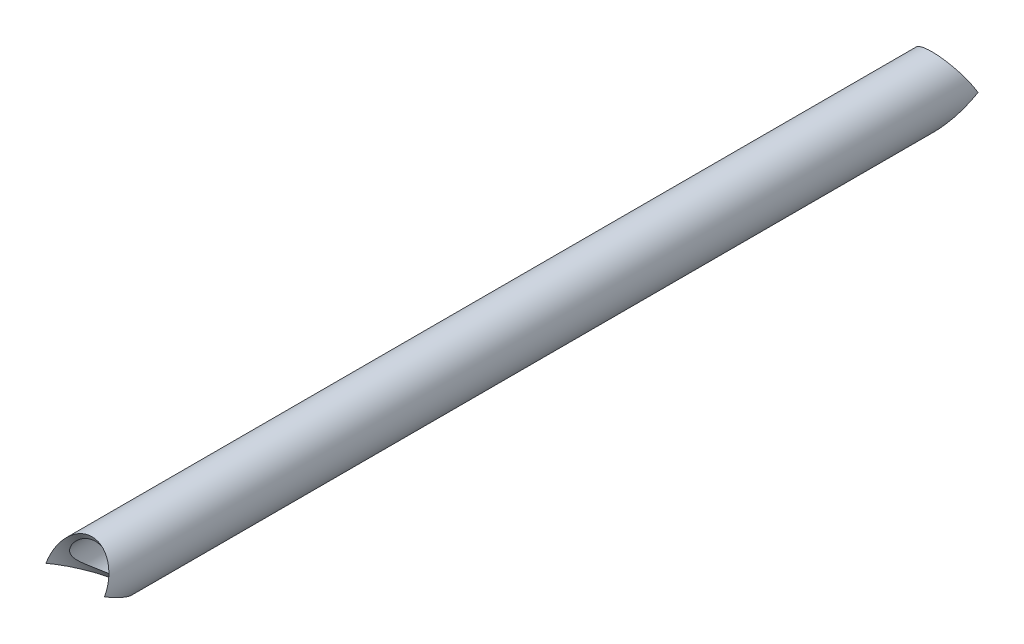
ISO-10303-21;
HEADER;
FILE_DESCRIPTION(('STEP AP214'),'2;1');
FILE_NAME('part.step','',(''),(''),'','','');
FILE_SCHEMA(('AUTOMOTIVE_DESIGN { 1 0 10303 214 1 1 1 1 }'));
ENDSEC;
DATA;
#1=APPLICATION_CONTEXT('core data for automotive mechanical design processes');
#2=APPLICATION_PROTOCOL_DEFINITION('international standard','automotive_design',2000,#1);
#3=PRODUCT_CONTEXT('',#1,'mechanical');
#4=PRODUCT('Part','Part','',(#3));
#5=PRODUCT_RELATED_PRODUCT_CATEGORY('part','',(#4));
#6=PRODUCT_DEFINITION_FORMATION('','',#4);
#7=PRODUCT_DEFINITION_CONTEXT('part definition',#1,'design');
#8=PRODUCT_DEFINITION('design','',#6,#7);
#9=PRODUCT_DEFINITION_SHAPE('','',#8);
#10=(LENGTH_UNIT() NAMED_UNIT(*) SI_UNIT(.MILLI.,.METRE.));
#11=(NAMED_UNIT(*) PLANE_ANGLE_UNIT() SI_UNIT($,.RADIAN.));
#12=(NAMED_UNIT(*) SI_UNIT($,.STERADIAN.) SOLID_ANGLE_UNIT());
#13=UNCERTAINTY_MEASURE_WITH_UNIT(LENGTH_MEASURE(1.E-05),#10,'distance_accuracy_value','');
#14=(GEOMETRIC_REPRESENTATION_CONTEXT(3) GLOBAL_UNCERTAINTY_ASSIGNED_CONTEXT((#13)) GLOBAL_UNIT_ASSIGNED_CONTEXT((#10,
#11,#12)) REPRESENTATION_CONTEXT('',''));
#15=CARTESIAN_POINT('',(0.,0.,0.));
#16=DIRECTION('',(0.,0.,1.));
#17=DIRECTION('',(1.,0.,0.));
#18=AXIS2_PLACEMENT_3D('',#15,#16,#17);
#19=CARTESIAN_POINT('',(8.58078819920598E-13,-5.32500000000106,-171.724170550265));
#20=DIRECTION('',(0.,0.,1.));
#21=DIRECTION('',(1.,0.,0.));
#22=AXIS2_PLACEMENT_3D('',#19,#20,#21);
#23=CYLINDRICAL_SURFACE('',#22,10.65);
#24=CARTESIAN_POINT('',(7.51697976491985E-13,-5.32500000000106,-159.425609816526));
#25=DIRECTION('',(0.,0.866025403784403,0.500000000000062));
#26=DIRECTION('',(0.,-0.500000000000061,0.866025403784403));
#27=AXIS2_PLACEMENT_3D('',#24,#25,#26);
#28=ELLIPSE('',#27,21.2999999999974,10.65);
#29=CARTESIAN_POINT('',(-10.6499999999992,-5.32500000000106,-159.425609816526));
#30=VERTEX_POINT('',#29);
#31=CARTESIAN_POINT('',(10.6500000000008,-5.32500000000106,-159.425609816526));
#32=VERTEX_POINT('',#31);
#33=EDGE_CURVE('E40',#30,#32,#28,.T.);
#34=ORIENTED_EDGE('',*,*,#33,.T.);
#35=CARTESIAN_POINT('',(7.51697976491985E-13,-5.32500000000106,-159.425609816526));
#36=DIRECTION('',(0.,-0.500000000000061,0.866025403784403));
#37=DIRECTION('',(0.,0.866025403784403,0.500000000000062));
#38=AXIS2_PLACEMENT_3D('',#35,#36,#37);
#39=ELLIPSE('',#38,12.2975607337395,10.65);
#40=EDGE_CURVE('E46',#32,#30,#39,.T.);
#41=ORIENTED_EDGE('',*,*,#40,.T.);
#42=EDGE_LOOP('',(#34,#41));
#43=FACE_BOUND('',#42,.T.);
#44=CARTESIAN_POINT('',(7.51697976491985E-13,-5.32500000000106,159.425609816526));
#45=DIRECTION('',(0.,-0.866025403784403,0.500000000000062));
#46=DIRECTION('',(0.,-0.500000000000061,-0.866025403784403));
#47=AXIS2_PLACEMENT_3D('',#44,#45,#46);
#48=ELLIPSE('',#47,21.2999999999974,10.65);
#49=CARTESIAN_POINT('',(-10.6499999999992,-5.32500000000106,159.425609816526));
#50=VERTEX_POINT('',#49);
#51=CARTESIAN_POINT('',(10.6500000000008,-5.32500000000106,159.425609816526));
#52=VERTEX_POINT('',#51);
#53=EDGE_CURVE('E65',#50,#52,#48,.T.);
#54=ORIENTED_EDGE('',*,*,#53,.F.);
#55=CARTESIAN_POINT('',(7.51697976491985E-13,-5.32500000000106,159.425609816526));
#56=DIRECTION('',(0.,0.500000000000061,0.866025403784403));
#57=DIRECTION('',(0.,0.866025403784403,-0.500000000000062));
#58=AXIS2_PLACEMENT_3D('',#55,#56,#57);
#59=ELLIPSE('',#58,12.2975607337395,10.65);
#60=EDGE_CURVE('E61',#52,#50,#59,.T.);
#61=ORIENTED_EDGE('',*,*,#60,.F.);
#62=EDGE_LOOP('',(#54,#61));
#63=FACE_BOUND('',#62,.T.);
#64=ADVANCED_FACE('F35',(#43,#63),#23,.T.);
#65=CARTESIAN_POINT('',(8.58078819920598E-13,-5.32500000000106,-171.724170550265));
#66=DIRECTION('',(0.,0.,1.));
#67=DIRECTION('',(1.,0.,0.));
#68=AXIS2_PLACEMENT_3D('',#65,#66,#67);
#69=CYLINDRICAL_SURFACE('',#68,8.65);
#70=CARTESIAN_POINT('',(8.65000000000086,-5.32500000000106,-152.251582588625));
#71=CARTESIAN_POINT('',(8.64999937803413,-5.17818391804204,-152.336346880909));
#72=CARTESIAN_POINT('',(8.64626274910793,-5.02875572478756,-152.416598939499));
#73=CARTESIAN_POINT('',(8.63051404007093,-4.72515065145031,-152.566664752119));
#74=CARTESIAN_POINT('',(8.61850310980591,-4.57097443402454,-152.636479954876));
#75=CARTESIAN_POINT('',(8.58549136002994,-4.25897766817823,-152.764392027044));
#76=CARTESIAN_POINT('',(8.56450206368842,-4.10116203550633,-152.822503776972));
#77=CARTESIAN_POINT('',(8.51297710355508,-3.78302790285182,-152.92636407599));
#78=CARTESIAN_POINT('',(8.4824414692768,-3.62270941060852,-152.9721126633));
#79=CARTESIAN_POINT('',(8.41148621828003,-3.30100459507898,-153.051150890299));
#80=CARTESIAN_POINT('',(8.37105601253875,-3.13961730921392,-153.084427084992));
#81=CARTESIAN_POINT('',(8.28030697487779,-2.81761051836962,-153.138973092529));
#82=CARTESIAN_POINT('',(8.22998781020974,-2.65699103941225,-153.16024250127));
#83=CARTESIAN_POINT('',(8.11955918288923,-2.33771822963521,-153.191868713436));
#84=CARTESIAN_POINT('',(8.05943008935795,-2.17906954214472,-153.202203318004));
#85=CARTESIAN_POINT('',(7.92980127102047,-1.86529040442405,-153.213292877645));
#86=CARTESIAN_POINT('',(7.86029883349743,-1.71016098793742,-153.214045053451));
#87=CARTESIAN_POINT('',(7.69251740767396,-1.36343015093562,-153.2066257828));
#88=CARTESIAN_POINT('',(7.59151815094413,-1.17319572048133,-153.196008886819));
#89=CARTESIAN_POINT('',(7.3760166785596,-0.801384915060074,-153.164903576271));
#90=CARTESIAN_POINT('',(7.26151062378813,-0.619811022423808,-153.144412349934));
#91=CARTESIAN_POINT('',(7.01974442801519,-0.266185998629746,-153.096289892589));
#92=CARTESIAN_POINT('',(6.89247464409796,-0.0941422220710086,-153.068653237999));
#93=CARTESIAN_POINT('',(6.62602035216184,0.239525172001036,-153.008607871275));
#94=CARTESIAN_POINT('',(6.4868366799598,0.401149519095308,-152.976199493784));
#95=CARTESIAN_POINT('',(6.19369921715794,0.717199408931598,-152.907764760097));
#96=CARTESIAN_POINT('',(6.03946719637301,0.871351742209456,-152.871669240225));
#97=CARTESIAN_POINT('',(5.71996280968006,1.16745458198317,-152.798337988726));
#98=CARTESIAN_POINT('',(5.55469039583207,1.30940503548949,-152.761102252148));
#99=CARTESIAN_POINT('',(5.21389860047987,1.58044322934785,-152.687000834823));
#100=CARTESIAN_POINT('',(5.03838164400018,1.70953399433942,-152.6501350689));
#101=CARTESIAN_POINT('',(4.67787691764207,1.95424676280558,-152.578035733545));
#102=CARTESIAN_POINT('',(4.49288897525244,2.06986852082046,-152.542802193866));
#103=CARTESIAN_POINT('',(4.08963935720818,2.30115050104219,-152.470633423184));
#104=CARTESIAN_POINT('',(3.87018262639317,2.41485316133154,-152.434074544967));
#105=CARTESIAN_POINT('',(3.42170434916196,2.62330748089677,-152.365738468748));
#106=CARTESIAN_POINT('',(3.19268197861215,2.7180575032083,-152.33396168384));
#107=CARTESIAN_POINT('',(2.72667233822152,2.8877489822424,-152.276260503498));
#108=CARTESIAN_POINT('',(2.48968464132797,2.96268937497658,-152.250336422429));
#109=CARTESIAN_POINT('',(2.00954587057624,3.09200831165879,-152.20518615958));
#110=CARTESIAN_POINT('',(1.7663952148908,3.14638824672308,-152.185959524659));
#111=CARTESIAN_POINT('',(1.28688815578046,3.23204637630684,-152.15551164378));
#112=CARTESIAN_POINT('',(1.05071773862624,3.26425324184443,-152.143969360807));
#113=CARTESIAN_POINT('',(0.576287751522747,3.30906969930768,-152.127876538466));
#114=CARTESIAN_POINT('',(0.338028232849662,3.32167977088252,-152.123325827972));
#115=CARTESIAN_POINT('',(-0.138694398065275,3.32717181019411,-152.121345993294));
#116=CARTESIAN_POINT('',(-0.377157454409688,3.32005809030354,-152.123915312398));
#117=CARTESIAN_POINT('',(-0.852499060907964,3.28618555813708,-152.136099206833));
#118=CARTESIAN_POINT('',(-1.08937763949912,3.25942709939346,-152.145713655377));
#119=CARTESIAN_POINT('',(-1.55084699909964,3.18792048410024,-152.17121963445));
#120=CARTESIAN_POINT('',(-1.77556361879889,3.14389120636481,-152.186859931647));
#121=CARTESIAN_POINT('',(-2.22033596035086,3.0383037352739,-152.223988694595));
#122=CARTESIAN_POINT('',(-2.4403918288887,2.97674609446185,-152.245476976));
#123=CARTESIAN_POINT('',(-2.8743918221639,2.83663978904617,-152.293716157682));
#124=CARTESIAN_POINT('',(-3.08833678882507,2.75809347794826,-152.320466328965));
#125=CARTESIAN_POINT('',(-3.50884695015005,2.58462882672561,-152.37848595427));
#126=CARTESIAN_POINT('',(-3.71541192514861,2.48970999976264,-152.409755542673));
#127=CARTESIAN_POINT('',(-4.12561504865878,2.28132550280638,-152.47682453091));
#128=CARTESIAN_POINT('',(-4.32901148650083,2.16741694084984,-152.51272582914));
#129=CARTESIAN_POINT('',(-4.72560996425152,1.92381198973291,-152.587156214713));
#130=CARTESIAN_POINT('',(-4.91881176220141,1.79411522609802,-152.625685364375));
#131=CARTESIAN_POINT('',(-5.2942600033521,1.5195220232304,-152.704019326186));
#132=CARTESIAN_POINT('',(-5.47649012979053,1.37460378460111,-152.743825909595));
#133=CARTESIAN_POINT('',(-5.82873985001069,1.070501220855,-152.822975853393));
#134=CARTESIAN_POINT('',(-5.99875927649425,0.911316700343723,-152.862319207429));
#135=CARTESIAN_POINT('',(-6.33518765876978,0.569797671430678,-152.940740789629));
#136=CARTESIAN_POINT('',(-6.5008132563437,0.386655559220814,-152.979670874343));
#137=CARTESIAN_POINT('',(-6.81634213928488,0.00614173894839123,-153.051855359197));
#138=CARTESIAN_POINT('',(-6.96624167784251,-0.19123334137223,-153.085108407933));
#139=CARTESIAN_POINT('',(-7.24880778216964,-0.598626237514269,-153.142302626));
#140=CARTESIAN_POINT('',(-7.38151120832197,-0.808615550188513,-153.166263939895));
#141=CARTESIAN_POINT('',(-7.62872444595244,-1.24005747422113,-153.200706798226));
#142=CARTESIAN_POINT('',(-7.74324661530695,-1.46150216240139,-153.211197533345));
#143=CARTESIAN_POINT('',(-7.9158766152873,-1.83394120082208,-153.213453861826));
#144=CARTESIAN_POINT('',(-7.97965328460072,-1.98229882171055,-153.210510511402));
#145=CARTESIAN_POINT('',(-8.09865941914346,-2.28194667178336,-153.195658752953));
#146=CARTESIAN_POINT('',(-8.15389168150537,-2.43323592292924,-153.183753286323));
#147=CARTESIAN_POINT('',(-8.25543809691463,-2.73735751112968,-153.149851195504));
#148=CARTESIAN_POINT('',(-8.30176915263708,-2.8901863317683,-153.12787397103));
#149=CARTESIAN_POINT('',(-8.38549388456836,-3.19634433805338,-153.072985934821));
#150=CARTESIAN_POINT('',(-8.42288752849195,-3.34967352550534,-153.04007508359));
#151=CARTESIAN_POINT('',(-8.48887463244737,-3.65583736997949,-152.962819916889));
#152=CARTESIAN_POINT('',(-8.51744234753686,-3.80866931717342,-152.918442833462));
#153=CARTESIAN_POINT('',(-8.56590540255607,-4.11200299044548,-152.818457093397));
#154=CARTESIAN_POINT('',(-8.58580081854654,-4.26250473694955,-152.76284853527));
#155=CARTESIAN_POINT('',(-8.61742448664772,-4.56019147256046,-152.640996012743));
#156=CARTESIAN_POINT('',(-8.62914387610692,-4.70737269563591,-152.574740602749));
#157=CARTESIAN_POINT('',(-8.64501885033532,-4.99748069427736,-152.432658779785));
#158=CARTESIAN_POINT('',(-8.64917188259916,-5.14040601813031,-152.356829146179));
#159=CARTESIAN_POINT('',(-8.65091176420799,-5.48194986378153,-152.162429780536));
#160=CARTESIAN_POINT('',(-8.64490991978726,-5.67810720221567,-152.039496812118));
#161=CARTESIAN_POINT('',(-8.62080404537245,-6.06052557385387,-151.780185838451));
#162=CARTESIAN_POINT('',(-8.60269349220057,-6.24678121442111,-151.643800620014));
#163=CARTESIAN_POINT('',(-8.55591593176062,-6.61050738599303,-151.360366255762));
#164=CARTESIAN_POINT('',(-8.52721453919726,-6.78794714119717,-151.213283641704));
#165=CARTESIAN_POINT('',(-8.46048539057246,-7.13436872185536,-150.911410831003));
#166=CARTESIAN_POINT('',(-8.42245385331452,-7.30334708467412,-150.756617529796));
#167=CARTESIAN_POINT('',(-8.33930780952857,-7.62840220804517,-150.446527773282));
#168=CARTESIAN_POINT('',(-8.29446233610269,-7.78471951600782,-150.291409697909));
#169=CARTESIAN_POINT('',(-8.1973875550997,-8.09107106241902,-149.977399875368));
#170=CARTESIAN_POINT('',(-8.1451593511135,-8.2411062356013,-149.818508695162));
#171=CARTESIAN_POINT('',(-8.03358147622553,-8.53574819848384,-149.497939035219));
#172=CARTESIAN_POINT('',(-7.97422521882663,-8.68034980294864,-149.336258097631));
#173=CARTESIAN_POINT('',(-7.84858289044737,-8.9645585980513,-149.011183076417));
#174=CARTESIAN_POINT('',(-7.78229605383263,-9.10416523459408,-148.847788805313));
#175=CARTESIAN_POINT('',(-7.64278789689118,-9.37889196675777,-148.520007469398));
#176=CARTESIAN_POINT('',(-7.56956237191821,-9.51400927413266,-148.355619859867));
#177=CARTESIAN_POINT('',(-7.41613086611502,-9.78000589104953,-148.026645920562));
#178=CARTESIAN_POINT('',(-7.33592422353052,-9.91088479720793,-147.86205957341));
#179=CARTESIAN_POINT('',(-7.16842967186056,-10.1685222937857,-147.533473896963));
#180=CARTESIAN_POINT('',(-7.08114669097899,-10.2952836670717,-147.369474240787));
#181=CARTESIAN_POINT('',(-6.89920629382302,-10.5448944677872,-147.04259138072));
#182=CARTESIAN_POINT('',(-6.80454875726912,-10.6677438313656,-146.879708195087));
#183=CARTESIAN_POINT('',(-6.5651998111919,-10.9615247675415,-146.486076960951));
#184=CARTESIAN_POINT('',(-6.41648661666454,-11.1304340932451,-146.256242483812));
#185=CARTESIAN_POINT('',(-6.10210401419091,-11.4600386200846,-145.802234552339));
#186=CARTESIAN_POINT('',(-5.93643204735805,-11.6207325761131,-145.5780619587));
#187=CARTESIAN_POINT('',(-5.58706670598627,-11.9327156751364,-145.138443174762));
#188=CARTESIAN_POINT('',(-5.40341885193473,-12.0840270662075,-144.922976799169));
#189=CARTESIAN_POINT('',(-5.01605964050916,-12.3762758979245,-144.503381560177));
#190=CARTESIAN_POINT('',(-4.81235869354345,-12.5172186556524,-144.299246899193));
#191=CARTESIAN_POINT('',(-4.46395431537741,-12.7358360010133,-143.980491065239));
#192=CARTESIAN_POINT('',(-4.32596965085762,-12.8173265353653,-143.861142903216));
#193=CARTESIAN_POINT('',(-4.04104693269422,-12.9747682172394,-143.629707893446));
#194=CARTESIAN_POINT('',(-3.89410768993998,-13.0507186261135,-143.517622014179));
#195=CARTESIAN_POINT('',(-3.43953622820752,-13.2688634312122,-143.194661392539));
#196=CARTESIAN_POINT('',(-3.11767000653535,-13.4016605290856,-142.996631189445));
#197=CARTESIAN_POINT('',(-2.51329904826341,-13.6064868217934,-142.68992820537));
#198=CARTESIAN_POINT('',(-2.23837288737248,-13.6854670464626,-142.571175308323));
#199=CARTESIAN_POINT('',(-1.81149183588487,-13.7844559440328,-142.422023838059));
#200=CARTESIAN_POINT('',(-1.66677696284393,-13.814206111826,-142.377135149486));
#201=CARTESIAN_POINT('',(-1.37323763265753,-13.866598663382,-142.298014086306));
#202=CARTESIAN_POINT('',(-1.22441515227355,-13.8892444033898,-142.263776679929));
#203=CARTESIAN_POINT('',(-0.922228530534202,-13.9270575526533,-142.206576123046));
#204=CARTESIAN_POINT('',(-0.768835207762092,-13.9421542687324,-142.183719557058));
#205=CARTESIAN_POINT('',(-0.460111209938487,-13.9641399656248,-142.150424523775));
#206=CARTESIAN_POINT('',(-0.304780550296094,-13.9710290116778,-142.139985957775));
#207=CARTESIAN_POINT('',(0.00631804623177885,-13.9763962343598,-142.13185377134));
#208=CARTESIAN_POINT('',(0.162085851107395,-13.9748767236458,-142.134156646548));
#209=CARTESIAN_POINT('',(0.47259757043343,-13.9634770717492,-142.151427005182));
#210=CARTESIAN_POINT('',(0.627341552834959,-13.9535974911499,-142.16639363944));
#211=CARTESIAN_POINT('',(0.914629127249681,-13.9275579323823,-142.20581475998));
#212=CARTESIAN_POINT('',(1.04746675019327,-13.9123698976835,-142.22880023586));
#213=CARTESIAN_POINT('',(1.31053948151418,-13.8761774918323,-142.283530232417));
#214=CARTESIAN_POINT('',(1.44077378597112,-13.8551713528792,-142.31527741528));
#215=CARTESIAN_POINT('',(1.82650942834383,-13.7839970078905,-142.422738637007));
#216=CARTESIAN_POINT('',(2.07716005820177,-13.7256618014445,-142.510689174858));
#217=CARTESIAN_POINT('',(2.67701044964193,-13.5587067369693,-142.761634615408));
#218=CARTESIAN_POINT('',(3.01657143771899,-13.439359772686,-142.940438017212));
#219=CARTESIAN_POINT('',(3.49694388024382,-13.2385470086136,-143.239347740658));
#220=CARTESIAN_POINT('',(3.65245291749766,-13.1678539232224,-143.344283741438));
#221=CARTESIAN_POINT('',(3.9541560580627,-13.0201478760528,-143.562763025771));
#222=CARTESIAN_POINT('',(4.10035178316948,-12.943136019982,-143.676304803156));
#223=CARTESIAN_POINT('',(4.47217067277788,-12.7339136251543,-143.983531450277));
#224=CARTESIAN_POINT('',(4.69046621582155,-12.5972318743139,-144.183035934355));
#225=CARTESIAN_POINT('',(5.1054204024205,-12.3121722294383,-144.595775253154));
#226=CARTESIAN_POINT('',(5.30206445824778,-12.1637865640121,-144.809019193362));
#227=CARTESIAN_POINT('',(5.676196892738,-11.856620248809,-145.246177363472));
#228=CARTESIAN_POINT('',(5.853616337795,-11.6978052714923,-145.470126094453));
#229=CARTESIAN_POINT('',(6.19021131260058,-11.3713821226299,-145.925040991454));
#230=CARTESIAN_POINT('',(6.34939068740992,-11.2037758152224,-146.156005665456));
#231=CARTESIAN_POINT('',(6.61712450602781,-10.8988278054273,-146.570274217489));
#232=CARTESIAN_POINT('',(6.72902472853615,-10.7631322708549,-146.752645771846));
#233=CARTESIAN_POINT('',(6.9432679239278,-10.4867928999731,-147.11927991284));
#234=CARTESIAN_POINT('',(7.04560988610154,-10.3461485425253,-147.303542697177));
#235=CARTESIAN_POINT('',(7.24122557898544,-10.0596872711622,-147.673200632293));
#236=CARTESIAN_POINT('',(7.33449006193118,-9.91386528463168,-147.85859673752));
#237=CARTESIAN_POINT('',(7.51210861764733,-9.61692902938116,-148.229402184679));
#238=CARTESIAN_POINT('',(7.59646314201736,-9.46581502940334,-148.414811525463));
#239=CARTESIAN_POINT('',(7.7562033711045,-9.15824485942135,-148.784195227607));
#240=CARTESIAN_POINT('',(7.83161100983235,-9.0018030172596,-148.968172019933));
#241=CARTESIAN_POINT('',(7.97368173187832,-8.68259257522668,-149.334056311631));
#242=CARTESIAN_POINT('',(8.04034383363486,-8.51982326784104,-149.515963576639));
#243=CARTESIAN_POINT('',(8.1645967093179,-8.18739573466357,-149.876084827612));
#244=CARTESIAN_POINT('',(8.22219981237345,-8.01774727408447,-150.054303541482));
#245=CARTESIAN_POINT('',(8.32794134031562,-7.67039006346122,-150.4055611801));
#246=CARTESIAN_POINT('',(8.3760828421231,-7.49268395698409,-150.578601773207));
#247=CARTESIAN_POINT('',(8.45472823516549,-7.15916947842955,-150.888375195556));
#248=CARTESIAN_POINT('',(8.48684042867084,-7.00481212056109,-151.0262572298));
#249=CARTESIAN_POINT('',(8.54328935211277,-6.68898150873794,-151.295370466487));
#250=CARTESIAN_POINT('',(8.56762596647593,-6.52750814905416,-151.426601570049));
#251=CARTESIAN_POINT('',(8.60751619567213,-6.19721879365621,-151.680090814578));
#252=CARTESIAN_POINT('',(8.62309164938132,-6.02842219524801,-151.802370599905));
#253=CARTESIAN_POINT('',(8.64433263886667,-5.68273682261175,-152.035908107663));
#254=CARTESIAN_POINT('',(8.65000076614849,-5.50585017696162,-152.147168705249));
#255=CARTESIAN_POINT('',(8.65000000000086,-5.32500000000106,-152.251582588625));
#256=B_SPLINE_CURVE_WITH_KNOTS('',3,(#70,#71,#72,#73,#74,#75,#76,#77,#78,#79,#80,#81,#82,#83,
#84,#85,#86,#87,#88,#89,#90,#91,#92,#93,#94,#95,#96,#97,#98,#99,#100,#101,#102,#103,#104,#105,
#106,#107,#108,#109,#110,#111,#112,#113,#114,#115,#116,#117,#118,#119,#120,#121,#122,#123,#124,
#125,#126,#127,#128,#129,#130,#131,#132,#133,#134,#135,#136,#137,#138,#139,#140,#141,#142,#143,
#144,#145,#146,#147,#148,#149,#150,#151,#152,#153,#154,#155,#156,#157,#158,#159,#160,#161,#162,
#163,#164,#165,#166,#167,#168,#169,#170,#171,#172,#173,#174,#175,#176,#177,#178,#179,#180,#181,
#182,#183,#184,#185,#186,#187,#188,#189,#190,#191,#192,#193,#194,#195,#196,#197,#198,#199,#200,
#201,#202,#203,#204,#205,#206,#207,#208,#209,#210,#211,#212,#213,#214,#215,#216,#217,#218,#219,
#220,#221,#222,#223,#224,#225,#226,#227,#228,#229,#230,#231,#232,#233,#234,#235,#236,#237,#238,
#239,#240,#241,#242,#243,#244,#245,#246,#247,#248,#249,#250,#251,#252,#253,#254,#255),
.UNSPECIFIED.,.T.,.F.,(4,2,2,2,2,2,2,2,2,2,2,2,2,2,2,2,2,2,2,2,2,2,2,2,2,2,2,2,2,2,2,2,2,2,2,2,
2,2,2,2,2,2,2,2,2,2,2,2,2,2,2,2,2,2,2,2,2,2,2,2,2,2,2,2,2,2,2,2,2,2,2,2,2,2,2,2,2,2,2,2,2,2,2,2,
2,2,2,2,2,2,2,2,4),(0.,0.508445067700346,1.01681949312024,1.52454340032982,2.03226573787241,
2.54053382673737,3.04881902097646,3.55813412185326,4.06759693996542,4.7135900294726,
5.35976717786689,6.00643624012425,6.65305997254488,7.31551844685087,7.97797979789349,
8.64028496620559,9.30260220250573,10.0512091879153,10.7998808036045,11.5485926227777,
12.2972537751969,13.0122575701417,13.7272438644489,14.4420738478248,15.1568909672331,
15.8446653307737,16.5324180161266,17.2200754854149,17.9077534057858,18.6145823037832,
19.3214279700607,20.0293001149052,20.7371819564204,21.486181752754,22.2353595985675,
22.9829040159491,23.729938128501,24.2140392664684,24.6979815901783,25.1809956610561,
25.664011476733,26.1484232132305,26.6328307010898,27.117762464654,27.6028577893435,
28.2964167818696,28.9903497083937,29.686555740942,30.3830443900298,31.0569944659831,
31.7308439043488,32.4053208577864,33.0798724008734,33.7548353491971,34.4298623484516,
35.1044232089343,35.7789950738536,36.7434305731185,37.708011809881,38.6702106916392,
39.6319126633935,40.2309613246268,40.8300897097657,42.0261773485566,42.9515592316291,
43.4142860297685,43.8767938980605,44.3435554209344,44.8103132336663,45.2769426775158,
45.7435408340745,46.1500870679646,46.5567569645805,47.3697458590116,48.5683011522664,
49.1693990091059,49.7703919045982,50.7462014804334,51.7226645377542,52.7025204724633,
53.6821694691645,54.4420360299657,55.2019828498199,55.962695941976,56.7233704590089,
57.4821398028628,58.2409942350116,58.9988067717562,59.7563724579484,60.3844095628076,
61.0124560021506,61.6389298975942,62.2652398987969),.UNSPECIFIED.);
#257=CARTESIAN_POINT('',(8.65000000000086,-5.32500000000106,-152.251582588625));
#258=VERTEX_POINT('',#257);
#259=EDGE_CURVE('E11',#258,#258,#256,.T.);
#260=ORIENTED_EDGE('',*,*,#259,.F.);
#261=EDGE_LOOP('',(#260));
#262=FACE_BOUND('',#261,.T.);
#263=CARTESIAN_POINT('',(8.65000000000086,-5.32500000000106,152.251582588625));
#264=CARTESIAN_POINT('',(8.64999937803413,-5.17818391804204,152.336346880909));
#265=CARTESIAN_POINT('',(8.64626274910793,-5.02875572478756,152.416598939499));
#266=CARTESIAN_POINT('',(8.63051404007093,-4.72515065145031,152.566664752119));
#267=CARTESIAN_POINT('',(8.61850310980591,-4.57097443402454,152.636479954876));
#268=CARTESIAN_POINT('',(8.58549136002994,-4.25897766817823,152.764392027044));
#269=CARTESIAN_POINT('',(8.56450206368842,-4.10116203550633,152.822503776972));
#270=CARTESIAN_POINT('',(8.51297710355508,-3.78302790285182,152.92636407599));
#271=CARTESIAN_POINT('',(8.4824414692768,-3.62270941060852,152.9721126633));
#272=CARTESIAN_POINT('',(8.41148621828003,-3.30100459507898,153.051150890299));
#273=CARTESIAN_POINT('',(8.37105601253875,-3.13961730921392,153.084427084992));
#274=CARTESIAN_POINT('',(8.28030697487779,-2.81761051836962,153.138973092529));
#275=CARTESIAN_POINT('',(8.22998781020974,-2.65699103941225,153.16024250127));
#276=CARTESIAN_POINT('',(8.11955918288923,-2.33771822963521,153.191868713436));
#277=CARTESIAN_POINT('',(8.05943008935795,-2.17906954214472,153.202203318004));
#278=CARTESIAN_POINT('',(7.92980127102047,-1.86529040442405,153.213292877645));
#279=CARTESIAN_POINT('',(7.86029883349743,-1.71016098793742,153.214045053451));
#280=CARTESIAN_POINT('',(7.69251740767396,-1.36343015093562,153.2066257828));
#281=CARTESIAN_POINT('',(7.59151815094413,-1.17319572048133,153.196008886819));
#282=CARTESIAN_POINT('',(7.3760166785596,-0.801384915060074,153.164903576271));
#283=CARTESIAN_POINT('',(7.26151062378813,-0.619811022423808,153.144412349934));
#284=CARTESIAN_POINT('',(7.01974442801519,-0.266185998629746,153.096289892589));
#285=CARTESIAN_POINT('',(6.89247464409796,-0.0941422220710086,153.068653237999));
#286=CARTESIAN_POINT('',(6.62602035216184,0.239525172001036,153.008607871275));
#287=CARTESIAN_POINT('',(6.4868366799598,0.401149519095308,152.976199493784));
#288=CARTESIAN_POINT('',(6.19369921715794,0.717199408931598,152.907764760097));
#289=CARTESIAN_POINT('',(6.03946719637301,0.871351742209456,152.871669240225));
#290=CARTESIAN_POINT('',(5.71996280968006,1.16745458198317,152.798337988726));
#291=CARTESIAN_POINT('',(5.55469039583207,1.30940503548949,152.761102252148));
#292=CARTESIAN_POINT('',(5.21389860047987,1.58044322934785,152.687000834823));
#293=CARTESIAN_POINT('',(5.03838164400018,1.70953399433942,152.6501350689));
#294=CARTESIAN_POINT('',(4.67787691764207,1.95424676280558,152.578035733545));
#295=CARTESIAN_POINT('',(4.49288897525244,2.06986852082046,152.542802193866));
#296=CARTESIAN_POINT('',(4.08963935720818,2.30115050104219,152.470633423184));
#297=CARTESIAN_POINT('',(3.87018262639317,2.41485316133154,152.434074544967));
#298=CARTESIAN_POINT('',(3.42170434916196,2.62330748089677,152.365738468748));
#299=CARTESIAN_POINT('',(3.19268197861215,2.7180575032083,152.33396168384));
#300=CARTESIAN_POINT('',(2.72667233822152,2.8877489822424,152.276260503498));
#301=CARTESIAN_POINT('',(2.48968464132797,2.96268937497658,152.250336422429));
#302=CARTESIAN_POINT('',(2.00954587057624,3.09200831165879,152.20518615958));
#303=CARTESIAN_POINT('',(1.7663952148908,3.14638824672308,152.185959524659));
#304=CARTESIAN_POINT('',(1.28688815578046,3.23204637630684,152.15551164378));
#305=CARTESIAN_POINT('',(1.05071773862624,3.26425324184443,152.143969360807));
#306=CARTESIAN_POINT('',(0.576287751522747,3.30906969930768,152.127876538466));
#307=CARTESIAN_POINT('',(0.338028232849662,3.32167977088252,152.123325827972));
#308=CARTESIAN_POINT('',(-0.138694398065275,3.32717181019411,152.121345993294));
#309=CARTESIAN_POINT('',(-0.377157454409688,3.32005809030354,152.123915312398));
#310=CARTESIAN_POINT('',(-0.852499060907964,3.28618555813708,152.136099206833));
#311=CARTESIAN_POINT('',(-1.08937763949912,3.25942709939346,152.145713655377));
#312=CARTESIAN_POINT('',(-1.55084699909964,3.18792048410024,152.17121963445));
#313=CARTESIAN_POINT('',(-1.77556361879889,3.14389120636481,152.186859931647));
#314=CARTESIAN_POINT('',(-2.22033596035086,3.0383037352739,152.223988694595));
#315=CARTESIAN_POINT('',(-2.4403918288887,2.97674609446185,152.245476976));
#316=CARTESIAN_POINT('',(-2.8743918221639,2.83663978904617,152.293716157682));
#317=CARTESIAN_POINT('',(-3.08833678882507,2.75809347794826,152.320466328965));
#318=CARTESIAN_POINT('',(-3.50884695015005,2.58462882672561,152.37848595427));
#319=CARTESIAN_POINT('',(-3.71541192514861,2.48970999976264,152.409755542673));
#320=CARTESIAN_POINT('',(-4.12561504865878,2.28132550280638,152.47682453091));
#321=CARTESIAN_POINT('',(-4.32901148650083,2.16741694084984,152.51272582914));
#322=CARTESIAN_POINT('',(-4.72560996425152,1.92381198973291,152.587156214713));
#323=CARTESIAN_POINT('',(-4.91881176220141,1.79411522609802,152.625685364375));
#324=CARTESIAN_POINT('',(-5.2942600033521,1.5195220232304,152.704019326186));
#325=CARTESIAN_POINT('',(-5.47649012979053,1.37460378460111,152.743825909595));
#326=CARTESIAN_POINT('',(-5.82873985001069,1.070501220855,152.822975853393));
#327=CARTESIAN_POINT('',(-5.99875927649425,0.911316700343723,152.862319207429));
#328=CARTESIAN_POINT('',(-6.33518765876978,0.569797671430678,152.940740789629));
#329=CARTESIAN_POINT('',(-6.5008132563437,0.386655559220814,152.979670874343));
#330=CARTESIAN_POINT('',(-6.81634213928488,0.00614173894839123,153.051855359197));
#331=CARTESIAN_POINT('',(-6.96624167784251,-0.19123334137223,153.085108407933));
#332=CARTESIAN_POINT('',(-7.24880778216964,-0.598626237514269,153.142302626));
#333=CARTESIAN_POINT('',(-7.38151120832197,-0.808615550188513,153.166263939895));
#334=CARTESIAN_POINT('',(-7.62872444595244,-1.24005747422113,153.200706798226));
#335=CARTESIAN_POINT('',(-7.74324661530695,-1.46150216240139,153.211197533345));
#336=CARTESIAN_POINT('',(-7.9158766152873,-1.83394120082208,153.213453861826));
#337=CARTESIAN_POINT('',(-7.97965328460072,-1.98229882171055,153.210510511402));
#338=CARTESIAN_POINT('',(-8.09865941914346,-2.28194667178336,153.195658752953));
#339=CARTESIAN_POINT('',(-8.15389168150537,-2.43323592292924,153.183753286323));
#340=CARTESIAN_POINT('',(-8.25543809691463,-2.73735751112968,153.149851195504));
#341=CARTESIAN_POINT('',(-8.30176915263708,-2.8901863317683,153.12787397103));
#342=CARTESIAN_POINT('',(-8.38549388456836,-3.19634433805338,153.072985934821));
#343=CARTESIAN_POINT('',(-8.42288752849195,-3.34967352550534,153.04007508359));
#344=CARTESIAN_POINT('',(-8.48887463244737,-3.65583736997949,152.962819916889));
#345=CARTESIAN_POINT('',(-8.51744234753686,-3.80866931717342,152.918442833462));
#346=CARTESIAN_POINT('',(-8.56590540255607,-4.11200299044548,152.818457093397));
#347=CARTESIAN_POINT('',(-8.58580081854654,-4.26250473694955,152.76284853527));
#348=CARTESIAN_POINT('',(-8.61742448664772,-4.56019147256046,152.640996012743));
#349=CARTESIAN_POINT('',(-8.62914387610692,-4.70737269563591,152.574740602749));
#350=CARTESIAN_POINT('',(-8.64501885033532,-4.99748069427736,152.432658779785));
#351=CARTESIAN_POINT('',(-8.64917188259916,-5.14040601813031,152.356829146179));
#352=CARTESIAN_POINT('',(-8.65091176420799,-5.48194986378153,152.162429780536));
#353=CARTESIAN_POINT('',(-8.64490991978726,-5.67810720221567,152.039496812118));
#354=CARTESIAN_POINT('',(-8.62080404537245,-6.06052557385387,151.780185838451));
#355=CARTESIAN_POINT('',(-8.60269349220057,-6.24678121442111,151.643800620014));
#356=CARTESIAN_POINT('',(-8.55591593176062,-6.61050738599303,151.360366255762));
#357=CARTESIAN_POINT('',(-8.52721453919726,-6.78794714119717,151.213283641704));
#358=CARTESIAN_POINT('',(-8.46048539057246,-7.13436872185536,150.911410831003));
#359=CARTESIAN_POINT('',(-8.42245385331452,-7.30334708467412,150.756617529796));
#360=CARTESIAN_POINT('',(-8.33930780952857,-7.62840220804517,150.446527773282));
#361=CARTESIAN_POINT('',(-8.29446233610269,-7.78471951600782,150.291409697909));
#362=CARTESIAN_POINT('',(-8.1973875550997,-8.09107106241902,149.977399875368));
#363=CARTESIAN_POINT('',(-8.1451593511135,-8.2411062356013,149.818508695162));
#364=CARTESIAN_POINT('',(-8.03358147622553,-8.53574819848384,149.497939035219));
#365=CARTESIAN_POINT('',(-7.97422521882663,-8.68034980294864,149.336258097631));
#366=CARTESIAN_POINT('',(-7.84858289044737,-8.9645585980513,149.011183076417));
#367=CARTESIAN_POINT('',(-7.78229605383263,-9.10416523459408,148.847788805313));
#368=CARTESIAN_POINT('',(-7.64278789689118,-9.37889196675777,148.520007469398));
#369=CARTESIAN_POINT('',(-7.56956237191821,-9.51400927413266,148.355619859867));
#370=CARTESIAN_POINT('',(-7.41613086611502,-9.78000589104953,148.026645920562));
#371=CARTESIAN_POINT('',(-7.33592422353052,-9.91088479720793,147.86205957341));
#372=CARTESIAN_POINT('',(-7.16842967186056,-10.1685222937857,147.533473896963));
#373=CARTESIAN_POINT('',(-7.08114669097899,-10.2952836670717,147.369474240787));
#374=CARTESIAN_POINT('',(-6.89920629382302,-10.5448944677872,147.04259138072));
#375=CARTESIAN_POINT('',(-6.80454875726912,-10.6677438313656,146.879708195087));
#376=CARTESIAN_POINT('',(-6.5651998111919,-10.9615247675415,146.486076960951));
#377=CARTESIAN_POINT('',(-6.41648661666454,-11.1304340932451,146.256242483812));
#378=CARTESIAN_POINT('',(-6.10210401419091,-11.4600386200846,145.802234552339));
#379=CARTESIAN_POINT('',(-5.93643204735805,-11.6207325761131,145.5780619587));
#380=CARTESIAN_POINT('',(-5.58706670598627,-11.9327156751364,145.138443174762));
#381=CARTESIAN_POINT('',(-5.40341885193473,-12.0840270662075,144.922976799169));
#382=CARTESIAN_POINT('',(-5.01605964050916,-12.3762758979245,144.503381560177));
#383=CARTESIAN_POINT('',(-4.81235869354345,-12.5172186556524,144.299246899193));
#384=CARTESIAN_POINT('',(-4.46395431537741,-12.7358360010133,143.980491065239));
#385=CARTESIAN_POINT('',(-4.32596965085762,-12.8173265353653,143.861142903216));
#386=CARTESIAN_POINT('',(-4.04104693269422,-12.9747682172394,143.629707893446));
#387=CARTESIAN_POINT('',(-3.89410768993998,-13.0507186261135,143.517622014179));
#388=CARTESIAN_POINT('',(-3.43953622820752,-13.2688634312122,143.194661392539));
#389=CARTESIAN_POINT('',(-3.11767000653535,-13.4016605290856,142.996631189445));
#390=CARTESIAN_POINT('',(-2.51329904826341,-13.6064868217934,142.68992820537));
#391=CARTESIAN_POINT('',(-2.23837288737248,-13.6854670464626,142.571175308323));
#392=CARTESIAN_POINT('',(-1.81149183588487,-13.7844559440328,142.422023838059));
#393=CARTESIAN_POINT('',(-1.66677696284393,-13.814206111826,142.377135149486));
#394=CARTESIAN_POINT('',(-1.37323763265753,-13.866598663382,142.298014086306));
#395=CARTESIAN_POINT('',(-1.22441515227355,-13.8892444033898,142.263776679929));
#396=CARTESIAN_POINT('',(-0.922228530534202,-13.9270575526533,142.206576123046));
#397=CARTESIAN_POINT('',(-0.768835207762092,-13.9421542687324,142.183719557058));
#398=CARTESIAN_POINT('',(-0.460111209938487,-13.9641399656248,142.150424523775));
#399=CARTESIAN_POINT('',(-0.304780550296094,-13.9710290116778,142.139985957775));
#400=CARTESIAN_POINT('',(0.00631804623177885,-13.9763962343598,142.13185377134));
#401=CARTESIAN_POINT('',(0.162085851107395,-13.9748767236458,142.134156646548));
#402=CARTESIAN_POINT('',(0.47259757043343,-13.9634770717492,142.151427005182));
#403=CARTESIAN_POINT('',(0.627341552834959,-13.9535974911499,142.16639363944));
#404=CARTESIAN_POINT('',(0.914629127249681,-13.9275579323823,142.20581475998));
#405=CARTESIAN_POINT('',(1.04746675019327,-13.9123698976835,142.22880023586));
#406=CARTESIAN_POINT('',(1.31053948151418,-13.8761774918323,142.283530232417));
#407=CARTESIAN_POINT('',(1.44077378597112,-13.8551713528792,142.31527741528));
#408=CARTESIAN_POINT('',(1.82650942834383,-13.7839970078905,142.422738637007));
#409=CARTESIAN_POINT('',(2.07716005820177,-13.7256618014445,142.510689174858));
#410=CARTESIAN_POINT('',(2.67701044964193,-13.5587067369693,142.761634615408));
#411=CARTESIAN_POINT('',(3.01657143771899,-13.439359772686,142.940438017212));
#412=CARTESIAN_POINT('',(3.49694388024382,-13.2385470086136,143.239347740658));
#413=CARTESIAN_POINT('',(3.65245291749766,-13.1678539232224,143.344283741438));
#414=CARTESIAN_POINT('',(3.9541560580627,-13.0201478760528,143.562763025771));
#415=CARTESIAN_POINT('',(4.10035178316948,-12.943136019982,143.676304803156));
#416=CARTESIAN_POINT('',(4.47217067277788,-12.7339136251543,143.983531450277));
#417=CARTESIAN_POINT('',(4.69046621582155,-12.5972318743139,144.183035934355));
#418=CARTESIAN_POINT('',(5.1054204024205,-12.3121722294383,144.595775253154));
#419=CARTESIAN_POINT('',(5.30206445824778,-12.1637865640121,144.809019193362));
#420=CARTESIAN_POINT('',(5.676196892738,-11.856620248809,145.246177363472));
#421=CARTESIAN_POINT('',(5.853616337795,-11.6978052714923,145.470126094453));
#422=CARTESIAN_POINT('',(6.19021131260058,-11.3713821226299,145.925040991454));
#423=CARTESIAN_POINT('',(6.34939068740992,-11.2037758152224,146.156005665456));
#424=CARTESIAN_POINT('',(6.61712450602781,-10.8988278054273,146.570274217489));
#425=CARTESIAN_POINT('',(6.72902472853615,-10.7631322708549,146.752645771846));
#426=CARTESIAN_POINT('',(6.9432679239278,-10.4867928999731,147.11927991284));
#427=CARTESIAN_POINT('',(7.04560988610154,-10.3461485425253,147.303542697177));
#428=CARTESIAN_POINT('',(7.24122557898544,-10.0596872711622,147.673200632293));
#429=CARTESIAN_POINT('',(7.33449006193118,-9.91386528463168,147.85859673752));
#430=CARTESIAN_POINT('',(7.51210861764733,-9.61692902938116,148.229402184679));
#431=CARTESIAN_POINT('',(7.59646314201736,-9.46581502940334,148.414811525463));
#432=CARTESIAN_POINT('',(7.7562033711045,-9.15824485942135,148.784195227607));
#433=CARTESIAN_POINT('',(7.83161100983235,-9.0018030172596,148.968172019933));
#434=CARTESIAN_POINT('',(7.97368173187832,-8.68259257522668,149.334056311631));
#435=CARTESIAN_POINT('',(8.04034383363486,-8.51982326784104,149.515963576639));
#436=CARTESIAN_POINT('',(8.1645967093179,-8.18739573466357,149.876084827612));
#437=CARTESIAN_POINT('',(8.22219981237345,-8.01774727408447,150.054303541482));
#438=CARTESIAN_POINT('',(8.32794134031562,-7.67039006346122,150.4055611801));
#439=CARTESIAN_POINT('',(8.3760828421231,-7.49268395698409,150.578601773207));
#440=CARTESIAN_POINT('',(8.45472823516549,-7.15916947842955,150.888375195556));
#441=CARTESIAN_POINT('',(8.48684042867084,-7.00481212056109,151.0262572298));
#442=CARTESIAN_POINT('',(8.54328935211277,-6.68898150873794,151.295370466487));
#443=CARTESIAN_POINT('',(8.56762596647593,-6.52750814905416,151.426601570049));
#444=CARTESIAN_POINT('',(8.60751619567213,-6.19721879365621,151.680090814578));
#445=CARTESIAN_POINT('',(8.62309164938132,-6.02842219524801,151.802370599905));
#446=CARTESIAN_POINT('',(8.64433263886667,-5.68273682261175,152.035908107663));
#447=CARTESIAN_POINT('',(8.65000076614849,-5.50585017696162,152.147168705249));
#448=CARTESIAN_POINT('',(8.65000000000086,-5.32500000000106,152.251582588625));
#449=B_SPLINE_CURVE_WITH_KNOTS('',3,(#263,#264,#265,#266,#267,#268,#269,#270,#271,#272,#273,
#274,#275,#276,#277,#278,#279,#280,#281,#282,#283,#284,#285,#286,#287,#288,#289,#290,#291,#292,
#293,#294,#295,#296,#297,#298,#299,#300,#301,#302,#303,#304,#305,#306,#307,#308,#309,#310,#311,
#312,#313,#314,#315,#316,#317,#318,#319,#320,#321,#322,#323,#324,#325,#326,#327,#328,#329,#330,
#331,#332,#333,#334,#335,#336,#337,#338,#339,#340,#341,#342,#343,#344,#345,#346,#347,#348,#349,
#350,#351,#352,#353,#354,#355,#356,#357,#358,#359,#360,#361,#362,#363,#364,#365,#366,#367,#368,
#369,#370,#371,#372,#373,#374,#375,#376,#377,#378,#379,#380,#381,#382,#383,#384,#385,#386,#387,
#388,#389,#390,#391,#392,#393,#394,#395,#396,#397,#398,#399,#400,#401,#402,#403,#404,#405,#406,
#407,#408,#409,#410,#411,#412,#413,#414,#415,#416,#417,#418,#419,#420,#421,#422,#423,#424,#425,
#426,#427,#428,#429,#430,#431,#432,#433,#434,#435,#436,#437,#438,#439,#440,#441,#442,#443,#444,
#445,#446,#447,#448),.UNSPECIFIED.,.T.,.F.,(4,2,2,2,2,2,2,2,2,2,2,2,2,2,2,2,2,2,2,2,2,2,2,2,2,2,
2,2,2,2,2,2,2,2,2,2,2,2,2,2,2,2,2,2,2,2,2,2,2,2,2,2,2,2,2,2,2,2,2,2,2,2,2,2,2,2,2,2,2,2,2,2,2,2,
2,2,2,2,2,2,2,2,2,2,2,2,2,2,2,2,2,2,4),(0.,0.508445067700346,1.01681949312024,1.52454340032982,
2.03226573787241,2.54053382673737,3.04881902097646,3.55813412185326,4.06759693996542,
4.7135900294726,5.35976717786689,6.00643624012425,6.65305997254488,7.31551844685087,
7.97797979789349,8.64028496620559,9.30260220250573,10.0512091879153,10.7998808036045,
11.5485926227777,12.2972537751969,13.0122575701417,13.7272438644489,14.4420738478248,
15.1568909672331,15.8446653307737,16.5324180161266,17.2200754854149,17.9077534057858,
18.6145823037832,19.3214279700607,20.0293001149052,20.7371819564204,21.486181752754,
22.2353595985675,22.9829040159491,23.729938128501,24.2140392664684,24.6979815901783,
25.1809956610561,25.664011476733,26.1484232132305,26.6328307010898,27.117762464654,
27.6028577893435,28.2964167818696,28.9903497083937,29.686555740942,30.3830443900298,
31.0569944659831,31.7308439043488,32.4053208577864,33.0798724008734,33.7548353491971,
34.4298623484516,35.1044232089343,35.7789950738536,36.7434305731185,37.708011809881,
38.6702106916392,39.6319126633935,40.2309613246268,40.8300897097657,42.0261773485566,
42.9515592316291,43.4142860297685,43.8767938980605,44.3435554209344,44.8103132336663,
45.2769426775158,45.7435408340745,46.1500870679646,46.5567569645805,47.3697458590116,
48.5683011522664,49.1693990091059,49.7703919045982,50.7462014804334,51.7226645377542,
52.7025204724633,53.6821694691645,54.4420360299657,55.2019828498199,55.962695941976,
56.7233704590089,57.4821398028628,58.2409942350116,58.9988067717562,59.7563724579484,
60.3844095628076,61.0124560021506,61.6389298975942,62.2652398987969),.UNSPECIFIED.);
#450=CARTESIAN_POINT('',(8.65000000000086,-5.32500000000106,152.251582588625));
#451=VERTEX_POINT('',#450);
#452=EDGE_CURVE('E67',#451,#451,#449,.T.);
#453=ORIENTED_EDGE('',*,*,#452,.T.);
#454=EDGE_LOOP('',(#453));
#455=FACE_BOUND('',#454,.T.);
#456=ADVANCED_FACE('F74',(#262,#455),#69,.F.);
#457=CARTESIAN_POINT('',(6.45317133063372E-13,2.4980018054066E-13,-162.49999999996));
#458=DIRECTION('',(0.,-0.86602540378451,0.499999999999877));
#459=DIRECTION('',(-1.,0.,0.));
#460=AXIS2_PLACEMENT_3D('',#457,#458,#459);
#461=CYLINDRICAL_SURFACE('',#460,10.65);
#462=ORIENTED_EDGE('',*,*,#40,.F.);
#463=ORIENTED_EDGE('',*,*,#33,.F.);
#464=EDGE_LOOP('',(#462,#463));
#465=FACE_BOUND('',#464,.T.);
#466=ORIENTED_EDGE('',*,*,#259,.T.);
#467=EDGE_LOOP('',(#466));
#468=FACE_BOUND('',#467,.T.);
#469=ADVANCED_FACE('F37',(#465,#468),#461,.F.);
#470=CARTESIAN_POINT('',(6.45317133063372E-13,2.4980018054066E-13,162.49999999996));
#471=DIRECTION('',(0.,-0.86602540378451,-0.499999999999877));
#472=DIRECTION('',(-1.,0.,0.));
#473=AXIS2_PLACEMENT_3D('',#470,#471,#472);
#474=CYLINDRICAL_SURFACE('',#473,10.65);
#475=ORIENTED_EDGE('',*,*,#60,.T.);
#476=ORIENTED_EDGE('',*,*,#53,.T.);
#477=EDGE_LOOP('',(#475,#476));
#478=FACE_BOUND('',#477,.T.);
#479=ORIENTED_EDGE('',*,*,#452,.F.);
#480=EDGE_LOOP('',(#479));
#481=FACE_BOUND('',#480,.T.);
#482=ADVANCED_FACE('F63',(#478,#481),#474,.F.);
#483=CLOSED_SHELL('',(#64,#456,#469,#482));
#484=MANIFOLD_SOLID_BREP('B2',#483);
#485=ADVANCED_BREP_SHAPE_REPRESENTATION('',(#18,#484),#14);
#486=SHAPE_DEFINITION_REPRESENTATION(#9,#485);
ENDSEC;
END-ISO-10303-21;
